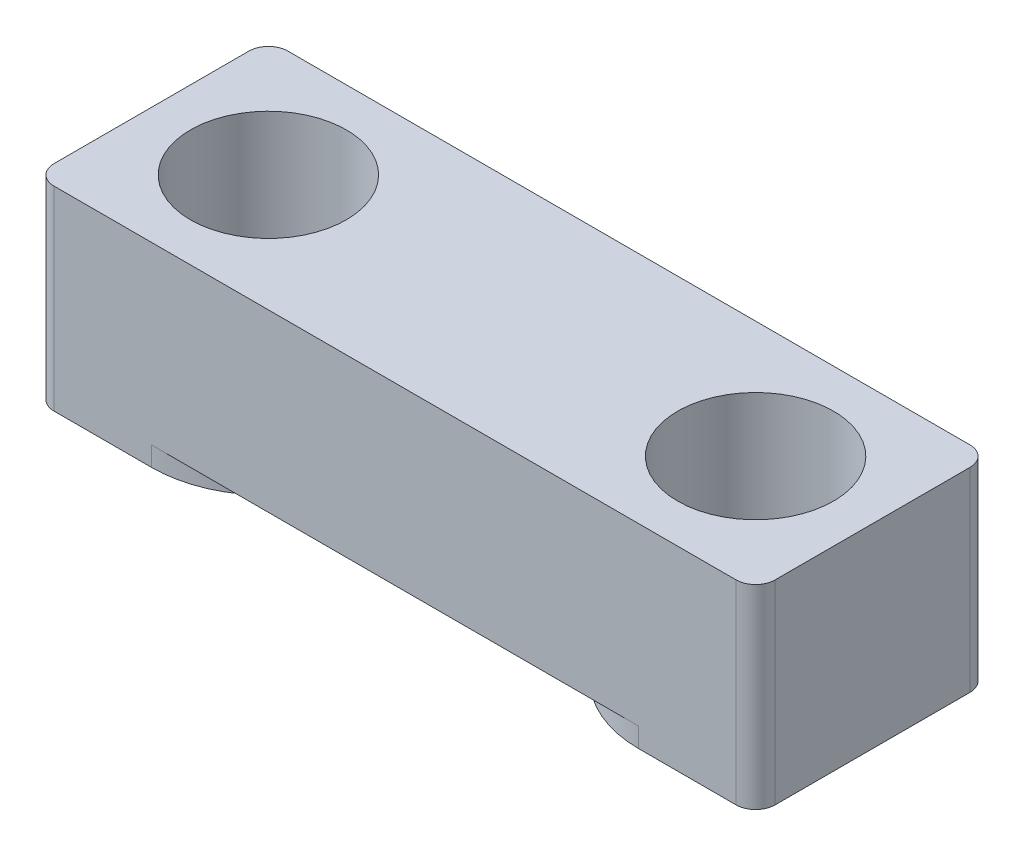
ISO-10303-21;
HEADER;
FILE_DESCRIPTION(('STEP AP214'),'2;1');
FILE_NAME('part.step','',(''),(''),'','','');
FILE_SCHEMA(('AUTOMOTIVE_DESIGN { 1 0 10303 214 1 1 1 1 }'));
ENDSEC;
DATA;
#1=APPLICATION_CONTEXT('core data for automotive mechanical design processes');
#2=APPLICATION_PROTOCOL_DEFINITION('international standard','automotive_design',2000,#1);
#3=PRODUCT_CONTEXT('',#1,'mechanical');
#4=PRODUCT('Part','Part','',(#3));
#5=PRODUCT_RELATED_PRODUCT_CATEGORY('part','',(#4));
#6=PRODUCT_DEFINITION_FORMATION('','',#4);
#7=PRODUCT_DEFINITION_CONTEXT('part definition',#1,'design');
#8=PRODUCT_DEFINITION('design','',#6,#7);
#9=PRODUCT_DEFINITION_SHAPE('','',#8);
#10=(LENGTH_UNIT() NAMED_UNIT(*) SI_UNIT(.MILLI.,.METRE.));
#11=(NAMED_UNIT(*) PLANE_ANGLE_UNIT() SI_UNIT($,.RADIAN.));
#12=(NAMED_UNIT(*) SI_UNIT($,.STERADIAN.) SOLID_ANGLE_UNIT());
#13=UNCERTAINTY_MEASURE_WITH_UNIT(LENGTH_MEASURE(1.E-05),#10,'distance_accuracy_value','');
#14=(GEOMETRIC_REPRESENTATION_CONTEXT(3) GLOBAL_UNCERTAINTY_ASSIGNED_CONTEXT((#13)) GLOBAL_UNIT_ASSIGNED_CONTEXT((#10,
#11,#12)) REPRESENTATION_CONTEXT('',''));
#15=CARTESIAN_POINT('',(0.,0.,0.));
#16=DIRECTION('',(0.,0.,1.));
#17=DIRECTION('',(1.,0.,0.));
#18=AXIS2_PLACEMENT_3D('',#15,#16,#17);
#19=CARTESIAN_POINT('',(0.,0.,0.));
#20=DIRECTION('',(0.,1.,0.));
#21=DIRECTION('',(0.,0.,1.));
#22=AXIS2_PLACEMENT_3D('',#19,#20,#21);
#23=PLANE('',#22);
#24=DIRECTION('',(-1.,0.,0.));
#25=VECTOR('',#24,1.);
#26=CARTESIAN_POINT('',(-7.4,0.,-2.4));
#27=LINE('',#26,#25);
#28=CARTESIAN_POINT('',(7.,0.,-2.4));
#29=VERTEX_POINT('',#28);
#30=CARTESIAN_POINT('',(5.,0.,-2.4));
#31=VERTEX_POINT('',#30);
#32=EDGE_CURVE('E178',#29,#31,#27,.T.);
#33=ORIENTED_EDGE('',*,*,#32,.F.);
#34=CARTESIAN_POINT('',(7.,0.,-2.));
#35=DIRECTION('',(0.,1.,0.));
#36=DIRECTION('',(0.,0.,1.));
#37=AXIS2_PLACEMENT_3D('',#34,#35,#36);
#38=CIRCLE('',#37,0.4);
#39=CARTESIAN_POINT('',(7.4,0.,-2.));
#40=VERTEX_POINT('',#39);
#41=EDGE_CURVE('E52',#29,#40,#38,.F.);
#42=ORIENTED_EDGE('',*,*,#41,.T.);
#43=DIRECTION('',(0.,0.,-1.));
#44=VECTOR('',#43,1.);
#45=CARTESIAN_POINT('',(7.4,0.,-2.4));
#46=LINE('',#45,#44);
#47=CARTESIAN_POINT('',(7.4,0.,2.));
#48=VERTEX_POINT('',#47);
#49=EDGE_CURVE('E193',#48,#40,#46,.T.);
#50=ORIENTED_EDGE('',*,*,#49,.F.);
#51=CARTESIAN_POINT('',(7.,0.,2.));
#52=DIRECTION('',(0.,1.,0.));
#53=DIRECTION('',(0.,0.,1.));
#54=AXIS2_PLACEMENT_3D('',#51,#52,#53);
#55=CIRCLE('',#54,0.4);
#56=CARTESIAN_POINT('',(7.,0.,2.4));
#57=VERTEX_POINT('',#56);
#58=EDGE_CURVE('E60',#48,#57,#55,.F.);
#59=ORIENTED_EDGE('',*,*,#58,.T.);
#60=DIRECTION('',(1.,0.,0.));
#61=VECTOR('',#60,1.);
#62=CARTESIAN_POINT('',(-7.4,0.,2.4));
#63=LINE('',#62,#61);
#64=CARTESIAN_POINT('',(5.,0.,2.4));
#65=VERTEX_POINT('',#64);
#66=EDGE_CURVE('E190',#65,#57,#63,.T.);
#67=ORIENTED_EDGE('',*,*,#66,.F.);
#68=CARTESIAN_POINT('',(5.,0.,0.));
#69=DIRECTION('',(0.,1.,0.));
#70=DIRECTION('',(0.,0.,-1.));
#71=AXIS2_PLACEMENT_3D('',#68,#69,#70);
#72=CIRCLE('',#71,2.4);
#73=EDGE_CURVE('E133',#31,#65,#72,.T.);
#74=ORIENTED_EDGE('',*,*,#73,.F.);
#75=EDGE_LOOP('',(#33,#42,#50,#59,#67,#74));
#76=FACE_BOUND('',#75,.T.);
#77=CARTESIAN_POINT('',(5.,0.,0.));
#78=DIRECTION('',(0.,-1.,0.));
#79=DIRECTION('',(0.,0.,-1.));
#80=AXIS2_PLACEMENT_3D('',#77,#78,#79);
#81=CIRCLE('',#80,1.1);
#82=CARTESIAN_POINT('',(5.,0.,-1.1));
#83=VERTEX_POINT('',#82);
#84=EDGE_CURVE('E333',#83,#83,#81,.T.);
#85=ORIENTED_EDGE('',*,*,#84,.F.);
#86=EDGE_LOOP('',(#85));
#87=FACE_BOUND('',#86,.T.);
#88=ADVANCED_FACE('F37',(#76,#87),#23,.F.);
#89=CARTESIAN_POINT('',(-7.4,4.,2.4));
#90=DIRECTION('',(0.,0.,-1.));
#91=DIRECTION('',(-1.,0.,0.));
#92=AXIS2_PLACEMENT_3D('',#89,#90,#91);
#93=PLANE('',#92);
#94=ORIENTED_EDGE('',*,*,#66,.T.);
#95=DIRECTION('',(0.,-1.,0.));
#96=VECTOR('',#95,1.);
#97=CARTESIAN_POINT('',(7.,4.,2.4));
#98=LINE('',#97,#96);
#99=CARTESIAN_POINT('',(7.,4.,2.4));
#100=VERTEX_POINT('',#99);
#101=EDGE_CURVE('E12',#57,#100,#98,.F.);
#102=ORIENTED_EDGE('',*,*,#101,.T.);
#103=DIRECTION('',(1.,0.,0.));
#104=VECTOR('',#103,1.);
#105=CARTESIAN_POINT('',(-7.4,4.,2.4));
#106=LINE('',#105,#104);
#107=CARTESIAN_POINT('',(-7.,4.,2.4));
#108=VERTEX_POINT('',#107);
#109=EDGE_CURVE('E177',#108,#100,#106,.T.);
#110=ORIENTED_EDGE('',*,*,#109,.F.);
#111=DIRECTION('',(0.,-1.,0.));
#112=VECTOR('',#111,1.);
#113=CARTESIAN_POINT('',(-7.,4.,2.4));
#114=LINE('',#113,#112);
#115=CARTESIAN_POINT('',(-7.,0.,2.4));
#116=VERTEX_POINT('',#115);
#117=EDGE_CURVE('E45',#108,#116,#114,.T.);
#118=ORIENTED_EDGE('',*,*,#117,.T.);
#119=CARTESIAN_POINT('',(-5.,0.,2.4));
#120=VERTEX_POINT('',#119);
#121=EDGE_CURVE('E191',#116,#120,#63,.T.);
#122=ORIENTED_EDGE('',*,*,#121,.T.);
#123=DIRECTION('',(0.,-1.,0.));
#124=VECTOR('',#123,1.);
#125=CARTESIAN_POINT('',(-5.,0.4,2.4));
#126=LINE('',#125,#124);
#127=CARTESIAN_POINT('',(-5.,0.4,2.4));
#128=VERTEX_POINT('',#127);
#129=EDGE_CURVE('E138',#128,#120,#126,.T.);
#130=ORIENTED_EDGE('',*,*,#129,.F.);
#131=DIRECTION('',(-1.,0.,0.));
#132=VECTOR('',#131,1.);
#133=CARTESIAN_POINT('',(5.,0.4,2.4));
#134=LINE('',#133,#132);
#135=CARTESIAN_POINT('',(5.,0.4,2.4));
#136=VERTEX_POINT('',#135);
#137=EDGE_CURVE('E144',#136,#128,#134,.T.);
#138=ORIENTED_EDGE('',*,*,#137,.F.);
#139=DIRECTION('',(0.,-1.,0.));
#140=VECTOR('',#139,1.);
#141=CARTESIAN_POINT('',(5.,0.4,2.4));
#142=LINE('',#141,#140);
#143=EDGE_CURVE('E126',#136,#65,#142,.T.);
#144=ORIENTED_EDGE('',*,*,#143,.T.);
#145=EDGE_LOOP('',(#94,#102,#110,#118,#122,#130,#138,#144));
#146=FACE_BOUND('',#145,.T.);
#147=ADVANCED_FACE('F150',(#146),#93,.F.);
#148=CARTESIAN_POINT('',(0.,4.,0.));
#149=DIRECTION('',(0.,1.,0.));
#150=DIRECTION('',(0.,0.,1.));
#151=AXIS2_PLACEMENT_3D('',#148,#149,#150);
#152=PLANE('',#151);
#153=CARTESIAN_POINT('',(-5.,4.,0.));
#154=DIRECTION('',(0.,1.,0.));
#155=DIRECTION('',(0.,0.,1.));
#156=AXIS2_PLACEMENT_3D('',#153,#154,#155);
#157=CIRCLE('',#156,1.6);
#158=CARTESIAN_POINT('',(-5.,4.,1.6));
#159=VERTEX_POINT('',#158);
#160=EDGE_CURVE('E170',#159,#159,#157,.T.);
#161=ORIENTED_EDGE('',*,*,#160,.F.);
#162=EDGE_LOOP('',(#161));
#163=FACE_BOUND('',#162,.T.);
#164=DIRECTION('',(-1.,0.,0.));
#165=VECTOR('',#164,1.);
#166=CARTESIAN_POINT('',(-7.4,4.,-2.4));
#167=LINE('',#166,#165);
#168=CARTESIAN_POINT('',(7.,4.,-2.4));
#169=VERTEX_POINT('',#168);
#170=CARTESIAN_POINT('',(-7.,4.,-2.4));
#171=VERTEX_POINT('',#170);
#172=EDGE_CURVE('E184',#169,#171,#167,.T.);
#173=ORIENTED_EDGE('',*,*,#172,.T.);
#174=CARTESIAN_POINT('',(-7.,4.,-2.));
#175=DIRECTION('',(0.,1.,0.));
#176=DIRECTION('',(0.,0.,1.));
#177=AXIS2_PLACEMENT_3D('',#174,#175,#176);
#178=CIRCLE('',#177,0.4);
#179=CARTESIAN_POINT('',(-7.4,4.,-2.));
#180=VERTEX_POINT('',#179);
#181=EDGE_CURVE('E222',#171,#180,#178,.T.);
#182=ORIENTED_EDGE('',*,*,#181,.T.);
#183=DIRECTION('',(0.,0.,1.));
#184=VECTOR('',#183,1.);
#185=CARTESIAN_POINT('',(-7.4,4.,-2.4));
#186=LINE('',#185,#184);
#187=CARTESIAN_POINT('',(-7.4,4.,2.));
#188=VERTEX_POINT('',#187);
#189=EDGE_CURVE('E174',#180,#188,#186,.T.);
#190=ORIENTED_EDGE('',*,*,#189,.T.);
#191=CARTESIAN_POINT('',(-7.,4.,2.));
#192=DIRECTION('',(0.,1.,0.));
#193=DIRECTION('',(0.,0.,1.));
#194=AXIS2_PLACEMENT_3D('',#191,#192,#193);
#195=CIRCLE('',#194,0.4);
#196=EDGE_CURVE('E216',#188,#108,#195,.T.);
#197=ORIENTED_EDGE('',*,*,#196,.T.);
#198=ORIENTED_EDGE('',*,*,#109,.T.);
#199=CARTESIAN_POINT('',(7.,4.,2.));
#200=DIRECTION('',(0.,1.,0.));
#201=DIRECTION('',(0.,0.,1.));
#202=AXIS2_PLACEMENT_3D('',#199,#200,#201);
#203=CIRCLE('',#202,0.4);
#204=CARTESIAN_POINT('',(7.4,4.,2.));
#205=VERTEX_POINT('',#204);
#206=EDGE_CURVE('E218',#100,#205,#203,.T.);
#207=ORIENTED_EDGE('',*,*,#206,.T.);
#208=DIRECTION('',(0.,0.,-1.));
#209=VECTOR('',#208,1.);
#210=CARTESIAN_POINT('',(7.4,4.,-2.4));
#211=LINE('',#210,#209);
#212=CARTESIAN_POINT('',(7.4,4.,-2.));
#213=VERTEX_POINT('',#212);
#214=EDGE_CURVE('E181',#205,#213,#211,.T.);
#215=ORIENTED_EDGE('',*,*,#214,.T.);
#216=CARTESIAN_POINT('',(7.,4.,-2.));
#217=DIRECTION('',(0.,1.,0.));
#218=DIRECTION('',(0.,0.,1.));
#219=AXIS2_PLACEMENT_3D('',#216,#217,#218);
#220=CIRCLE('',#219,0.4);
#221=EDGE_CURVE('E220',#213,#169,#220,.T.);
#222=ORIENTED_EDGE('',*,*,#221,.T.);
#223=EDGE_LOOP('',(#173,#182,#190,#197,#198,#207,#215,#222));
#224=FACE_BOUND('',#223,.T.);
#225=CARTESIAN_POINT('',(5.,4.,0.));
#226=DIRECTION('',(0.,1.,0.));
#227=DIRECTION('',(0.,0.,1.));
#228=AXIS2_PLACEMENT_3D('',#225,#226,#227);
#229=CIRCLE('',#228,1.6);
#230=CARTESIAN_POINT('',(5.,4.,1.6));
#231=VERTEX_POINT('',#230);
#232=EDGE_CURVE('E163',#231,#231,#229,.T.);
#233=ORIENTED_EDGE('',*,*,#232,.F.);
#234=EDGE_LOOP('',(#233));
#235=FACE_BOUND('',#234,.T.);
#236=ADVANCED_FACE('F253',(#163,#224,#235),#152,.T.);
#237=DIRECTION('',(0.,0.,1.));
#238=VECTOR('',#237,1.);
#239=CARTESIAN_POINT('',(-7.4,0.,-2.4));
#240=LINE('',#239,#238);
#241=CARTESIAN_POINT('',(-7.4,0.,-2.));
#242=VERTEX_POINT('',#241);
#243=CARTESIAN_POINT('',(-7.4,0.,2.));
#244=VERTEX_POINT('',#243);
#245=EDGE_CURVE('E173',#242,#244,#240,.T.);
#246=ORIENTED_EDGE('',*,*,#245,.F.);
#247=CARTESIAN_POINT('',(-7.,0.,-2.));
#248=DIRECTION('',(0.,1.,0.));
#249=DIRECTION('',(0.,0.,1.));
#250=AXIS2_PLACEMENT_3D('',#247,#248,#249);
#251=CIRCLE('',#250,0.4);
#252=CARTESIAN_POINT('',(-7.,0.,-2.4));
#253=VERTEX_POINT('',#252);
#254=EDGE_CURVE('E209',#242,#253,#251,.F.);
#255=ORIENTED_EDGE('',*,*,#254,.T.);
#256=CARTESIAN_POINT('',(-5.,0.,-2.4));
#257=VERTEX_POINT('',#256);
#258=EDGE_CURVE('E195',#257,#253,#27,.T.);
#259=ORIENTED_EDGE('',*,*,#258,.F.);
#260=CARTESIAN_POINT('',(-5.,0.,0.));
#261=DIRECTION('',(0.,1.,0.));
#262=DIRECTION('',(0.,0.,-1.));
#263=AXIS2_PLACEMENT_3D('',#260,#261,#262);
#264=CIRCLE('',#263,2.4);
#265=EDGE_CURVE('E148',#120,#257,#264,.T.);
#266=ORIENTED_EDGE('',*,*,#265,.F.);
#267=ORIENTED_EDGE('',*,*,#121,.F.);
#268=CARTESIAN_POINT('',(-7.,0.,2.));
#269=DIRECTION('',(0.,1.,0.));
#270=DIRECTION('',(0.,0.,1.));
#271=AXIS2_PLACEMENT_3D('',#268,#269,#270);
#272=CIRCLE('',#271,0.4);
#273=EDGE_CURVE('E207',#116,#244,#272,.F.);
#274=ORIENTED_EDGE('',*,*,#273,.T.);
#275=EDGE_LOOP('',(#246,#255,#259,#266,#267,#274));
#276=FACE_BOUND('',#275,.T.);
#277=CARTESIAN_POINT('',(-5.,0.,0.));
#278=DIRECTION('',(0.,-1.,0.));
#279=DIRECTION('',(0.,0.,-1.));
#280=AXIS2_PLACEMENT_3D('',#277,#278,#279);
#281=CIRCLE('',#280,1.1);
#282=CARTESIAN_POINT('',(-5.,0.,-1.1));
#283=VERTEX_POINT('',#282);
#284=EDGE_CURVE('E328',#283,#283,#281,.T.);
#285=ORIENTED_EDGE('',*,*,#284,.F.);
#286=EDGE_LOOP('',(#285));
#287=FACE_BOUND('',#286,.T.);
#288=ADVANCED_FACE('F238',(#276,#287),#23,.F.);
#289=CARTESIAN_POINT('',(-7.4,4.,-2.4));
#290=DIRECTION('',(1.,0.,0.));
#291=DIRECTION('',(0.,0.,-1.));
#292=AXIS2_PLACEMENT_3D('',#289,#290,#291);
#293=PLANE('',#292);
#294=ORIENTED_EDGE('',*,*,#189,.F.);
#295=DIRECTION('',(0.,-1.,0.));
#296=VECTOR('',#295,1.);
#297=CARTESIAN_POINT('',(-7.4,4.,-2.));
#298=LINE('',#297,#296);
#299=EDGE_CURVE('E204',#180,#242,#298,.T.);
#300=ORIENTED_EDGE('',*,*,#299,.T.);
#301=ORIENTED_EDGE('',*,*,#245,.T.);
#302=DIRECTION('',(0.,-1.,0.));
#303=VECTOR('',#302,1.);
#304=CARTESIAN_POINT('',(-7.4,4.,2.));
#305=LINE('',#304,#303);
#306=EDGE_CURVE('E202',#244,#188,#305,.F.);
#307=ORIENTED_EDGE('',*,*,#306,.T.);
#308=EDGE_LOOP('',(#294,#300,#301,#307));
#309=FACE_BOUND('',#308,.T.);
#310=ADVANCED_FACE('F269',(#309),#293,.F.);
#311=CARTESIAN_POINT('',(7.4,4.,-2.4));
#312=DIRECTION('',(-1.,0.,0.));
#313=DIRECTION('',(0.,0.,1.));
#314=AXIS2_PLACEMENT_3D('',#311,#312,#313);
#315=PLANE('',#314);
#316=ORIENTED_EDGE('',*,*,#49,.T.);
#317=DIRECTION('',(0.,-1.,0.));
#318=VECTOR('',#317,1.);
#319=CARTESIAN_POINT('',(7.4,4.,-2.));
#320=LINE('',#319,#318);
#321=EDGE_CURVE('E228',#40,#213,#320,.F.);
#322=ORIENTED_EDGE('',*,*,#321,.T.);
#323=ORIENTED_EDGE('',*,*,#214,.F.);
#324=DIRECTION('',(0.,-1.,0.));
#325=VECTOR('',#324,1.);
#326=CARTESIAN_POINT('',(7.4,4.,2.));
#327=LINE('',#326,#325);
#328=EDGE_CURVE('E226',#205,#48,#327,.T.);
#329=ORIENTED_EDGE('',*,*,#328,.T.);
#330=EDGE_LOOP('',(#316,#322,#323,#329));
#331=FACE_BOUND('',#330,.T.);
#332=ADVANCED_FACE('F257',(#331),#315,.F.);
#333=CARTESIAN_POINT('',(-7.4,4.,-2.4));
#334=DIRECTION('',(0.,0.,1.));
#335=DIRECTION('',(1.,0.,0.));
#336=AXIS2_PLACEMENT_3D('',#333,#334,#335);
#337=PLANE('',#336);
#338=ORIENTED_EDGE('',*,*,#258,.T.);
#339=DIRECTION('',(0.,-1.,0.));
#340=VECTOR('',#339,1.);
#341=CARTESIAN_POINT('',(-7.,4.,-2.4));
#342=LINE('',#341,#340);
#343=EDGE_CURVE('E214',#253,#171,#342,.F.);
#344=ORIENTED_EDGE('',*,*,#343,.T.);
#345=ORIENTED_EDGE('',*,*,#172,.F.);
#346=DIRECTION('',(0.,-1.,0.));
#347=VECTOR('',#346,1.);
#348=CARTESIAN_POINT('',(7.,4.,-2.4));
#349=LINE('',#348,#347);
#350=EDGE_CURVE('E211',#169,#29,#349,.T.);
#351=ORIENTED_EDGE('',*,*,#350,.T.);
#352=ORIENTED_EDGE('',*,*,#32,.T.);
#353=DIRECTION('',(0.,-1.,0.));
#354=VECTOR('',#353,1.);
#355=CARTESIAN_POINT('',(5.,0.4,-2.4));
#356=LINE('',#355,#354);
#357=CARTESIAN_POINT('',(5.,0.4,-2.4));
#358=VERTEX_POINT('',#357);
#359=EDGE_CURVE('E161',#358,#31,#356,.T.);
#360=ORIENTED_EDGE('',*,*,#359,.F.);
#361=DIRECTION('',(1.,0.,0.));
#362=VECTOR('',#361,1.);
#363=CARTESIAN_POINT('',(-5.,0.4,-2.4));
#364=LINE('',#363,#362);
#365=CARTESIAN_POINT('',(-5.,0.4,-2.4));
#366=VERTEX_POINT('',#365);
#367=EDGE_CURVE('E139',#366,#358,#364,.T.);
#368=ORIENTED_EDGE('',*,*,#367,.F.);
#369=DIRECTION('',(0.,-1.,0.));
#370=VECTOR('',#369,1.);
#371=CARTESIAN_POINT('',(-5.,0.4,-2.4));
#372=LINE('',#371,#370);
#373=EDGE_CURVE('E164',#366,#257,#372,.T.);
#374=ORIENTED_EDGE('',*,*,#373,.T.);
#375=EDGE_LOOP('',(#338,#344,#345,#351,#352,#360,#368,#374));
#376=FACE_BOUND('',#375,.T.);
#377=ADVANCED_FACE('F246',(#376),#337,.F.);
#378=CARTESIAN_POINT('',(-5.,4.,0.));
#379=DIRECTION('',(0.,-1.,0.));
#380=DIRECTION('',(0.,0.,-1.));
#381=AXIS2_PLACEMENT_3D('',#378,#379,#380);
#382=CYLINDRICAL_SURFACE('',#381,1.6);
#383=CARTESIAN_POINT('',(-5.,1.,0.));
#384=DIRECTION('',(0.,1.,0.));
#385=DIRECTION('',(0.,0.,1.));
#386=AXIS2_PLACEMENT_3D('',#383,#384,#385);
#387=CIRCLE('',#386,1.6);
#388=CARTESIAN_POINT('',(-5.,1.,1.6));
#389=VERTEX_POINT('',#388);
#390=EDGE_CURVE('E199',#389,#389,#387,.T.);
#391=ORIENTED_EDGE('',*,*,#390,.F.);
#392=EDGE_LOOP('',(#391));
#393=FACE_BOUND('',#392,.T.);
#394=ORIENTED_EDGE('',*,*,#160,.T.);
#395=EDGE_LOOP('',(#394));
#396=FACE_BOUND('',#395,.T.);
#397=ADVANCED_FACE('F294',(#393,#396),#382,.F.);
#398=CARTESIAN_POINT('',(5.,4.,0.));
#399=DIRECTION('',(0.,-1.,0.));
#400=DIRECTION('',(0.,0.,-1.));
#401=AXIS2_PLACEMENT_3D('',#398,#399,#400);
#402=CYLINDRICAL_SURFACE('',#401,1.6);
#403=CARTESIAN_POINT('',(5.,1.,0.));
#404=DIRECTION('',(0.,1.,0.));
#405=DIRECTION('',(0.,0.,1.));
#406=AXIS2_PLACEMENT_3D('',#403,#404,#405);
#407=CIRCLE('',#406,1.6);
#408=CARTESIAN_POINT('',(5.,1.,1.6));
#409=VERTEX_POINT('',#408);
#410=EDGE_CURVE('E187',#409,#409,#407,.T.);
#411=ORIENTED_EDGE('',*,*,#410,.F.);
#412=EDGE_LOOP('',(#411));
#413=FACE_BOUND('',#412,.T.);
#414=ORIENTED_EDGE('',*,*,#232,.T.);
#415=EDGE_LOOP('',(#414));
#416=FACE_BOUND('',#415,.T.);
#417=ADVANCED_FACE('F297',(#413,#416),#402,.F.);
#418=CARTESIAN_POINT('',(5.,0.4,0.));
#419=DIRECTION('',(0.,-1.,0.));
#420=DIRECTION('',(0.,0.,-1.));
#421=AXIS2_PLACEMENT_3D('',#418,#419,#420);
#422=CYLINDRICAL_SURFACE('',#421,2.4);
#423=ORIENTED_EDGE('',*,*,#73,.T.);
#424=ORIENTED_EDGE('',*,*,#143,.F.);
#425=CARTESIAN_POINT('',(5.,0.4,0.));
#426=DIRECTION('',(0.,1.,0.));
#427=DIRECTION('',(0.,0.,-1.));
#428=AXIS2_PLACEMENT_3D('',#425,#426,#427);
#429=CIRCLE('',#428,2.4);
#430=EDGE_CURVE('E130',#358,#136,#429,.T.);
#431=ORIENTED_EDGE('',*,*,#430,.F.);
#432=ORIENTED_EDGE('',*,*,#359,.T.);
#433=EDGE_LOOP('',(#423,#424,#431,#432));
#434=FACE_BOUND('',#433,.T.);
#435=ADVANCED_FACE('F128',(#434),#422,.T.);
#436=CARTESIAN_POINT('',(-5.,0.4,0.));
#437=DIRECTION('',(0.,-1.,0.));
#438=DIRECTION('',(0.,0.,-1.));
#439=AXIS2_PLACEMENT_3D('',#436,#437,#438);
#440=CYLINDRICAL_SURFACE('',#439,2.4);
#441=ORIENTED_EDGE('',*,*,#265,.T.);
#442=ORIENTED_EDGE('',*,*,#373,.F.);
#443=CARTESIAN_POINT('',(-5.,0.4,0.));
#444=DIRECTION('',(0.,1.,0.));
#445=DIRECTION('',(0.,0.,-1.));
#446=AXIS2_PLACEMENT_3D('',#443,#444,#445);
#447=CIRCLE('',#446,2.4);
#448=EDGE_CURVE('E152',#128,#366,#447,.T.);
#449=ORIENTED_EDGE('',*,*,#448,.F.);
#450=ORIENTED_EDGE('',*,*,#129,.T.);
#451=EDGE_LOOP('',(#441,#442,#449,#450));
#452=FACE_BOUND('',#451,.T.);
#453=ADVANCED_FACE('F244',(#452),#440,.T.);
#454=CARTESIAN_POINT('',(5.,0.4,0.));
#455=DIRECTION('',(0.,-1.,0.));
#456=DIRECTION('',(0.,0.,-1.));
#457=AXIS2_PLACEMENT_3D('',#454,#455,#456);
#458=PLANE('',#457);
#459=ORIENTED_EDGE('',*,*,#430,.T.);
#460=ORIENTED_EDGE('',*,*,#137,.T.);
#461=ORIENTED_EDGE('',*,*,#448,.T.);
#462=ORIENTED_EDGE('',*,*,#367,.T.);
#463=EDGE_LOOP('',(#459,#460,#461,#462));
#464=FACE_BOUND('',#463,.T.);
#465=ADVANCED_FACE('F143',(#464),#458,.T.);
#466=CARTESIAN_POINT('',(5.,8.5254833995939,0.));
#467=DIRECTION('',(0.,-1.,0.));
#468=DIRECTION('',(0.,0.,-1.));
#469=AXIS2_PLACEMENT_3D('',#466,#467,#468);
#470=CYLINDRICAL_SURFACE('',#469,1.1);
#471=CARTESIAN_POINT('',(5.,1.,0.));
#472=DIRECTION('',(0.,1.,0.));
#473=DIRECTION('',(0.,0.,1.));
#474=AXIS2_PLACEMENT_3D('',#471,#472,#473);
#475=CIRCLE('',#474,1.1);
#476=CARTESIAN_POINT('',(5.,1.,-1.1));
#477=VERTEX_POINT('',#476);
#478=EDGE_CURVE('E159',#477,#477,#475,.F.);
#479=CARTESIAN_POINT('',(5.,0.,-1.1));
#480=CARTESIAN_POINT('',(5.,0.0104166666666684,-1.1));
#481=CARTESIAN_POINT('',(5.,0.0208333333333351,-1.1));
#482=CARTESIAN_POINT('',(5.,0.0416666666666684,-1.1));
#483=CARTESIAN_POINT('',(5.,0.0520833333333351,-1.1));
#484=CARTESIAN_POINT('',(5.,0.0729166666666685,-1.1));
#485=CARTESIAN_POINT('',(5.,0.0833333333333351,-1.1));
#486=CARTESIAN_POINT('',(5.,0.104166666666669,-1.1));
#487=CARTESIAN_POINT('',(5.,0.114583333333335,-1.1));
#488=CARTESIAN_POINT('',(5.,0.135416666666669,-1.1));
#489=CARTESIAN_POINT('',(5.,0.145833333333335,-1.1));
#490=CARTESIAN_POINT('',(5.,0.166666666666669,-1.1));
#491=CARTESIAN_POINT('',(5.,0.177083333333335,-1.1));
#492=CARTESIAN_POINT('',(5.,0.197916666666669,-1.1));
#493=CARTESIAN_POINT('',(5.,0.208333333333335,-1.1));
#494=CARTESIAN_POINT('',(5.,0.229166666666669,-1.1));
#495=CARTESIAN_POINT('',(5.,0.239583333333335,-1.1));
#496=CARTESIAN_POINT('',(5.,0.260416666666669,-1.1));
#497=CARTESIAN_POINT('',(5.,0.270833333333335,-1.1));
#498=CARTESIAN_POINT('',(5.,0.291666666666669,-1.1));
#499=CARTESIAN_POINT('',(5.,0.302083333333335,-1.1));
#500=CARTESIAN_POINT('',(5.,0.322916666666669,-1.1));
#501=CARTESIAN_POINT('',(5.,0.333333333333335,-1.1));
#502=CARTESIAN_POINT('',(5.,0.354166666666669,-1.1));
#503=CARTESIAN_POINT('',(5.,0.364583333333335,-1.1));
#504=CARTESIAN_POINT('',(5.,0.385416666666669,-1.1));
#505=CARTESIAN_POINT('',(5.,0.395833333333335,-1.1));
#506=CARTESIAN_POINT('',(5.,0.416666666666669,-1.1));
#507=CARTESIAN_POINT('',(5.,0.427083333333335,-1.1));
#508=CARTESIAN_POINT('',(5.,0.447916666666669,-1.1));
#509=CARTESIAN_POINT('',(5.,0.458333333333335,-1.1));
#510=CARTESIAN_POINT('',(5.,0.479166666666669,-1.1));
#511=CARTESIAN_POINT('',(5.,0.489583333333335,-1.1));
#512=CARTESIAN_POINT('',(5.,0.510416666666669,-1.1));
#513=CARTESIAN_POINT('',(5.,0.520833333333335,-1.1));
#514=CARTESIAN_POINT('',(5.,0.541666666666668,-1.1));
#515=CARTESIAN_POINT('',(5.,0.552083333333334,-1.1));
#516=CARTESIAN_POINT('',(5.,0.572916666666667,-1.1));
#517=CARTESIAN_POINT('',(5.,0.583333333333334,-1.1));
#518=CARTESIAN_POINT('',(5.,0.604166666666667,-1.1));
#519=CARTESIAN_POINT('',(5.,0.614583333333334,-1.1));
#520=CARTESIAN_POINT('',(5.,0.635416666666667,-1.1));
#521=CARTESIAN_POINT('',(5.,0.645833333333334,-1.1));
#522=CARTESIAN_POINT('',(5.,0.666666666666667,-1.1));
#523=CARTESIAN_POINT('',(5.,0.677083333333334,-1.1));
#524=CARTESIAN_POINT('',(5.,0.697916666666667,-1.1));
#525=CARTESIAN_POINT('',(5.,0.708333333333333,-1.1));
#526=CARTESIAN_POINT('',(5.,0.729166666666667,-1.1));
#527=CARTESIAN_POINT('',(5.,0.739583333333333,-1.1));
#528=CARTESIAN_POINT('',(5.,0.760416666666667,-1.1));
#529=CARTESIAN_POINT('',(5.,0.770833333333333,-1.1));
#530=CARTESIAN_POINT('',(5.,0.791666666666667,-1.1));
#531=CARTESIAN_POINT('',(5.,0.802083333333333,-1.1));
#532=CARTESIAN_POINT('',(5.,0.822916666666667,-1.1));
#533=CARTESIAN_POINT('',(5.,0.833333333333333,-1.1));
#534=CARTESIAN_POINT('',(5.,0.854166666666667,-1.1));
#535=CARTESIAN_POINT('',(5.,0.864583333333333,-1.1));
#536=CARTESIAN_POINT('',(5.,0.885416666666667,-1.1));
#537=CARTESIAN_POINT('',(5.,0.895833333333333,-1.1));
#538=CARTESIAN_POINT('',(5.,0.916666666666667,-1.1));
#539=CARTESIAN_POINT('',(5.,0.927083333333333,-1.1));
#540=CARTESIAN_POINT('',(5.,0.947916666666667,-1.1));
#541=CARTESIAN_POINT('',(5.,0.958333333333333,-1.1));
#542=CARTESIAN_POINT('',(5.,0.979166666666667,-1.1));
#543=CARTESIAN_POINT('',(5.,0.989583333333333,-1.1));
#544=CARTESIAN_POINT('',(5.,1.,-1.1));
#545=B_SPLINE_CURVE_WITH_KNOTS('',3,(#479,#480,#481,#482,#483,#484,#485,#486,#487,#488,#489,
#490,#491,#492,#493,#494,#495,#496,#497,#498,#499,#500,#501,#502,#503,#504,#505,#506,#507,#508,
#509,#510,#511,#512,#513,#514,#515,#516,#517,#518,#519,#520,#521,#522,#523,#524,#525,#526,#527,
#528,#529,#530,#531,#532,#533,#534,#535,#536,#537,#538,#539,#540,#541,#542,#543,#544),
.UNSPECIFIED.,.F.,.F.,(4,2,2,2,2,2,2,2,2,2,2,2,2,2,2,2,2,2,2,2,2,2,2,2,2,2,2,2,2,2,2,2,4),(0.,
0.03125,0.0625000000000001,0.0937500000000001,0.125,0.15625,0.1875,0.21875,0.25,0.28125,0.3125,
0.34375,0.375,0.40625,0.4375,0.46875,0.5,0.53125,0.562499999999999,0.593749999999999,
0.624999999999999,0.656249999999999,0.687499999999999,0.718749999999998,0.749999999999998,
0.781249999999998,0.812499999999998,0.843749999999998,0.874999999999998,0.906249999999998,
0.937499999999998,0.968749999999998,0.999999999999998),.UNSPECIFIED.);
#546=EDGE_CURVE('BSEAM308',#83,#477,#545,.T.);
#547=ORIENTED_EDGE('',*,*,#84,.T.);
#548=ORIENTED_EDGE('',*,*,#478,.F.);
#549=ORIENTED_EDGE('',*,*,#546,.T.);
#550=ORIENTED_EDGE('',*,*,#546,.F.);
#551=EDGE_LOOP('',(#547,#549,#548,#550));
#552=FACE_BOUND('',#551,.T.);
#553=ADVANCED_FACE('F308',(#552),#470,.F.);
#554=CARTESIAN_POINT('',(0.,1.,0.));
#555=DIRECTION('',(0.,1.,0.));
#556=DIRECTION('',(0.,0.,1.));
#557=AXIS2_PLACEMENT_3D('',#554,#555,#556);
#558=PLANE('',#557);
#559=ORIENTED_EDGE('',*,*,#410,.T.);
#560=EDGE_LOOP('',(#559));
#561=FACE_BOUND('',#560,.T.);
#562=ORIENTED_EDGE('',*,*,#478,.T.);
#563=EDGE_LOOP('',(#562));
#564=FACE_BOUND('',#563,.T.);
#565=ADVANCED_FACE('F309',(#561,#564),#558,.T.);
#566=CARTESIAN_POINT('',(-5.,8.5254833995939,0.));
#567=DIRECTION('',(0.,-1.,0.));
#568=DIRECTION('',(0.,0.,-1.));
#569=AXIS2_PLACEMENT_3D('',#566,#567,#568);
#570=CYLINDRICAL_SURFACE('',#569,1.1);
#571=CARTESIAN_POINT('',(-5.,1.,0.));
#572=DIRECTION('',(0.,1.,0.));
#573=DIRECTION('',(0.,0.,1.));
#574=AXIS2_PLACEMENT_3D('',#571,#572,#573);
#575=CIRCLE('',#574,1.1);
#576=CARTESIAN_POINT('',(-5.,1.,-1.1));
#577=VERTEX_POINT('',#576);
#578=EDGE_CURVE('E331',#577,#577,#575,.F.);
#579=CARTESIAN_POINT('',(-5.,0.,-1.1));
#580=CARTESIAN_POINT('',(-5.,0.0104166666666684,-1.1));
#581=CARTESIAN_POINT('',(-5.,0.0208333333333351,-1.1));
#582=CARTESIAN_POINT('',(-5.,0.0416666666666684,-1.1));
#583=CARTESIAN_POINT('',(-5.,0.0520833333333351,-1.1));
#584=CARTESIAN_POINT('',(-5.,0.0729166666666685,-1.1));
#585=CARTESIAN_POINT('',(-5.,0.0833333333333351,-1.1));
#586=CARTESIAN_POINT('',(-5.,0.104166666666669,-1.1));
#587=CARTESIAN_POINT('',(-5.,0.114583333333335,-1.1));
#588=CARTESIAN_POINT('',(-5.,0.135416666666669,-1.1));
#589=CARTESIAN_POINT('',(-5.,0.145833333333335,-1.1));
#590=CARTESIAN_POINT('',(-5.,0.166666666666669,-1.1));
#591=CARTESIAN_POINT('',(-5.,0.177083333333335,-1.1));
#592=CARTESIAN_POINT('',(-5.,0.197916666666669,-1.1));
#593=CARTESIAN_POINT('',(-5.,0.208333333333335,-1.1));
#594=CARTESIAN_POINT('',(-5.,0.229166666666669,-1.1));
#595=CARTESIAN_POINT('',(-5.,0.239583333333335,-1.1));
#596=CARTESIAN_POINT('',(-5.,0.260416666666669,-1.1));
#597=CARTESIAN_POINT('',(-5.,0.270833333333335,-1.1));
#598=CARTESIAN_POINT('',(-5.,0.291666666666669,-1.1));
#599=CARTESIAN_POINT('',(-5.,0.302083333333335,-1.1));
#600=CARTESIAN_POINT('',(-5.,0.322916666666669,-1.1));
#601=CARTESIAN_POINT('',(-5.,0.333333333333335,-1.1));
#602=CARTESIAN_POINT('',(-5.,0.354166666666669,-1.1));
#603=CARTESIAN_POINT('',(-5.,0.364583333333335,-1.1));
#604=CARTESIAN_POINT('',(-5.,0.385416666666669,-1.1));
#605=CARTESIAN_POINT('',(-5.,0.395833333333335,-1.1));
#606=CARTESIAN_POINT('',(-5.,0.416666666666669,-1.1));
#607=CARTESIAN_POINT('',(-5.,0.427083333333335,-1.1));
#608=CARTESIAN_POINT('',(-5.,0.447916666666669,-1.1));
#609=CARTESIAN_POINT('',(-5.,0.458333333333335,-1.1));
#610=CARTESIAN_POINT('',(-5.,0.479166666666669,-1.1));
#611=CARTESIAN_POINT('',(-5.,0.489583333333335,-1.1));
#612=CARTESIAN_POINT('',(-5.,0.510416666666669,-1.1));
#613=CARTESIAN_POINT('',(-5.,0.520833333333335,-1.1));
#614=CARTESIAN_POINT('',(-5.,0.541666666666668,-1.1));
#615=CARTESIAN_POINT('',(-5.,0.552083333333334,-1.1));
#616=CARTESIAN_POINT('',(-5.,0.572916666666667,-1.1));
#617=CARTESIAN_POINT('',(-5.,0.583333333333334,-1.1));
#618=CARTESIAN_POINT('',(-5.,0.604166666666667,-1.1));
#619=CARTESIAN_POINT('',(-5.,0.614583333333334,-1.1));
#620=CARTESIAN_POINT('',(-5.,0.635416666666667,-1.1));
#621=CARTESIAN_POINT('',(-5.,0.645833333333334,-1.1));
#622=CARTESIAN_POINT('',(-5.,0.666666666666667,-1.1));
#623=CARTESIAN_POINT('',(-5.,0.677083333333334,-1.1));
#624=CARTESIAN_POINT('',(-5.,0.697916666666667,-1.1));
#625=CARTESIAN_POINT('',(-5.,0.708333333333333,-1.1));
#626=CARTESIAN_POINT('',(-5.,0.729166666666667,-1.1));
#627=CARTESIAN_POINT('',(-5.,0.739583333333333,-1.1));
#628=CARTESIAN_POINT('',(-5.,0.760416666666667,-1.1));
#629=CARTESIAN_POINT('',(-5.,0.770833333333333,-1.1));
#630=CARTESIAN_POINT('',(-5.,0.791666666666667,-1.1));
#631=CARTESIAN_POINT('',(-5.,0.802083333333333,-1.1));
#632=CARTESIAN_POINT('',(-5.,0.822916666666667,-1.1));
#633=CARTESIAN_POINT('',(-5.,0.833333333333333,-1.1));
#634=CARTESIAN_POINT('',(-5.,0.854166666666667,-1.1));
#635=CARTESIAN_POINT('',(-5.,0.864583333333333,-1.1));
#636=CARTESIAN_POINT('',(-5.,0.885416666666667,-1.1));
#637=CARTESIAN_POINT('',(-5.,0.895833333333333,-1.1));
#638=CARTESIAN_POINT('',(-5.,0.916666666666667,-1.1));
#639=CARTESIAN_POINT('',(-5.,0.927083333333333,-1.1));
#640=CARTESIAN_POINT('',(-5.,0.947916666666667,-1.1));
#641=CARTESIAN_POINT('',(-5.,0.958333333333333,-1.1));
#642=CARTESIAN_POINT('',(-5.,0.979166666666667,-1.1));
#643=CARTESIAN_POINT('',(-5.,0.989583333333333,-1.1));
#644=CARTESIAN_POINT('',(-5.,1.,-1.1));
#645=B_SPLINE_CURVE_WITH_KNOTS('',3,(#579,#580,#581,#582,#583,#584,#585,#586,#587,#588,#589,
#590,#591,#592,#593,#594,#595,#596,#597,#598,#599,#600,#601,#602,#603,#604,#605,#606,#607,#608,
#609,#610,#611,#612,#613,#614,#615,#616,#617,#618,#619,#620,#621,#622,#623,#624,#625,#626,#627,
#628,#629,#630,#631,#632,#633,#634,#635,#636,#637,#638,#639,#640,#641,#642,#643,#644),
.UNSPECIFIED.,.F.,.F.,(4,2,2,2,2,2,2,2,2,2,2,2,2,2,2,2,2,2,2,2,2,2,2,2,2,2,2,2,2,2,2,2,4),(0.,
0.03125,0.0625000000000001,0.0937500000000001,0.125,0.15625,0.1875,0.21875,0.25,0.28125,0.3125,
0.34375,0.375,0.40625,0.4375,0.46875,0.5,0.53125,0.562499999999999,0.593749999999999,
0.624999999999999,0.656249999999999,0.687499999999999,0.718749999999998,0.749999999999998,
0.781249999999998,0.812499999999998,0.843749999999998,0.874999999999998,0.906249999999998,
0.937499999999998,0.968749999999998,0.999999999999998),.UNSPECIFIED.);
#646=EDGE_CURVE('BSEAM312',#283,#577,#645,.T.);
#647=ORIENTED_EDGE('',*,*,#284,.T.);
#648=ORIENTED_EDGE('',*,*,#578,.F.);
#649=ORIENTED_EDGE('',*,*,#646,.T.);
#650=ORIENTED_EDGE('',*,*,#646,.F.);
#651=EDGE_LOOP('',(#647,#649,#648,#650));
#652=FACE_BOUND('',#651,.T.);
#653=ADVANCED_FACE('F312',(#652),#570,.F.);
#654=CARTESIAN_POINT('',(0.,1.,0.));
#655=DIRECTION('',(0.,1.,0.));
#656=DIRECTION('',(0.,0.,1.));
#657=AXIS2_PLACEMENT_3D('',#654,#655,#656);
#658=PLANE('',#657);
#659=ORIENTED_EDGE('',*,*,#390,.T.);
#660=EDGE_LOOP('',(#659));
#661=FACE_BOUND('',#660,.T.);
#662=ORIENTED_EDGE('',*,*,#578,.T.);
#663=EDGE_LOOP('',(#662));
#664=FACE_BOUND('',#663,.T.);
#665=ADVANCED_FACE('F317',(#661,#664),#658,.T.);
#666=CARTESIAN_POINT('',(-7.,4.,-2.));
#667=DIRECTION('',(0.,-1.,0.));
#668=DIRECTION('',(0.,0.,-1.));
#669=AXIS2_PLACEMENT_3D('',#666,#667,#668);
#670=CYLINDRICAL_SURFACE('',#669,0.4);
#671=ORIENTED_EDGE('',*,*,#181,.F.);
#672=ORIENTED_EDGE('',*,*,#343,.F.);
#673=ORIENTED_EDGE('',*,*,#254,.F.);
#674=ORIENTED_EDGE('',*,*,#299,.F.);
#675=EDGE_LOOP('',(#671,#672,#673,#674));
#676=FACE_BOUND('',#675,.T.);
#677=ADVANCED_FACE('F265',(#676),#670,.T.);
#678=CARTESIAN_POINT('',(7.,4.,-2.));
#679=DIRECTION('',(0.,-1.,0.));
#680=DIRECTION('',(0.,0.,-1.));
#681=AXIS2_PLACEMENT_3D('',#678,#679,#680);
#682=CYLINDRICAL_SURFACE('',#681,0.4);
#683=ORIENTED_EDGE('',*,*,#221,.F.);
#684=ORIENTED_EDGE('',*,*,#321,.F.);
#685=ORIENTED_EDGE('',*,*,#41,.F.);
#686=ORIENTED_EDGE('',*,*,#350,.F.);
#687=EDGE_LOOP('',(#683,#684,#685,#686));
#688=FACE_BOUND('',#687,.T.);
#689=ADVANCED_FACE('F260',(#688),#682,.T.);
#690=CARTESIAN_POINT('',(7.,4.,2.));
#691=DIRECTION('',(0.,-1.,0.));
#692=DIRECTION('',(0.,0.,-1.));
#693=AXIS2_PLACEMENT_3D('',#690,#691,#692);
#694=CYLINDRICAL_SURFACE('',#693,0.4);
#695=ORIENTED_EDGE('',*,*,#206,.F.);
#696=ORIENTED_EDGE('',*,*,#101,.F.);
#697=ORIENTED_EDGE('',*,*,#58,.F.);
#698=ORIENTED_EDGE('',*,*,#328,.F.);
#699=EDGE_LOOP('',(#695,#696,#697,#698));
#700=FACE_BOUND('',#699,.T.);
#701=ADVANCED_FACE('F250',(#700),#694,.T.);
#702=CARTESIAN_POINT('',(-7.,4.,2.));
#703=DIRECTION('',(0.,-1.,0.));
#704=DIRECTION('',(0.,0.,-1.));
#705=AXIS2_PLACEMENT_3D('',#702,#703,#704);
#706=CYLINDRICAL_SURFACE('',#705,0.4);
#707=ORIENTED_EDGE('',*,*,#196,.F.);
#708=ORIENTED_EDGE('',*,*,#306,.F.);
#709=ORIENTED_EDGE('',*,*,#273,.F.);
#710=ORIENTED_EDGE('',*,*,#117,.F.);
#711=EDGE_LOOP('',(#707,#708,#709,#710));
#712=FACE_BOUND('',#711,.T.);
#713=ADVANCED_FACE('F39',(#712),#706,.T.);
#714=CLOSED_SHELL('',(#88,#147,#236,#288,#310,#332,#377,#397,#417,#435,#453,#465,#553,#565,#653,
#665,#677,#689,#701,#713));
#715=MANIFOLD_SOLID_BREP('B2',#714);
#716=ADVANCED_BREP_SHAPE_REPRESENTATION('',(#18,#715),#14);
#717=SHAPE_DEFINITION_REPRESENTATION(#9,#716);
ENDSEC;
END-ISO-10303-21;
